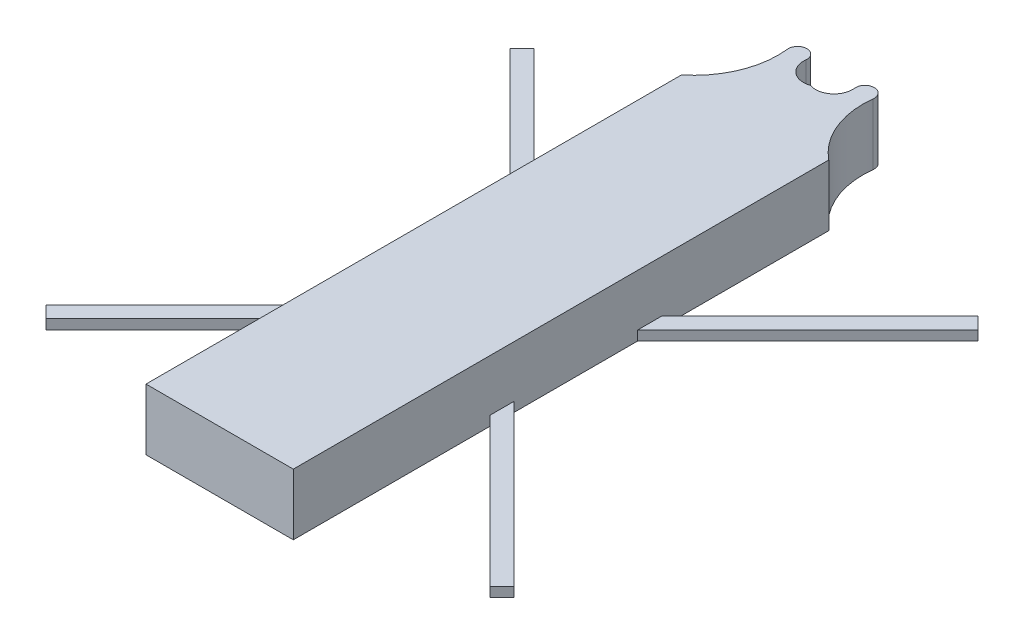
ISO-10303-21;
HEADER;
FILE_DESCRIPTION(('STEP AP214'),'2;1');
FILE_NAME('part.step','',(''),(''),'','','');
FILE_SCHEMA(('AUTOMOTIVE_DESIGN { 1 0 10303 214 1 1 1 1 }'));
ENDSEC;
DATA;
#1=APPLICATION_CONTEXT('core data for automotive mechanical design processes');
#2=APPLICATION_PROTOCOL_DEFINITION('international standard','automotive_design',2000,#1);
#3=PRODUCT_CONTEXT('',#1,'mechanical');
#4=PRODUCT('Part','Part','',(#3));
#5=PRODUCT_RELATED_PRODUCT_CATEGORY('part','',(#4));
#6=PRODUCT_DEFINITION_FORMATION('','',#4);
#7=PRODUCT_DEFINITION_CONTEXT('part definition',#1,'design');
#8=PRODUCT_DEFINITION('design','',#6,#7);
#9=PRODUCT_DEFINITION_SHAPE('','',#8);
#10=(LENGTH_UNIT() NAMED_UNIT(*) SI_UNIT(.MILLI.,.METRE.));
#11=(NAMED_UNIT(*) PLANE_ANGLE_UNIT() SI_UNIT($,.RADIAN.));
#12=(NAMED_UNIT(*) SI_UNIT($,.STERADIAN.) SOLID_ANGLE_UNIT());
#13=UNCERTAINTY_MEASURE_WITH_UNIT(LENGTH_MEASURE(1.E-05),#10,'distance_accuracy_value','');
#14=(GEOMETRIC_REPRESENTATION_CONTEXT(3) GLOBAL_UNCERTAINTY_ASSIGNED_CONTEXT((#13)) GLOBAL_UNIT_ASSIGNED_CONTEXT((#10,
#11,#12)) REPRESENTATION_CONTEXT('',''));
#15=CARTESIAN_POINT('',(0.,0.,0.));
#16=DIRECTION('',(0.,0.,1.));
#17=DIRECTION('',(1.,0.,0.));
#18=AXIS2_PLACEMENT_3D('',#15,#16,#17);
#19=CARTESIAN_POINT('',(-35.1155,0.,35.1155000000002));
#20=DIRECTION('',(-1.,0.,0.));
#21=DIRECTION('',(0.,0.,1.));
#22=AXIS2_PLACEMENT_3D('',#19,#20,#21);
#23=PLANE('',#22);
#24=DIRECTION('',(0.,-1.,0.));
#25=VECTOR('',#24,1.);
#26=CARTESIAN_POINT('',(-35.1155,29.21,-105.41));
#27=LINE('',#26,#25);
#28=CARTESIAN_POINT('',(-35.1155,29.21,-105.41));
#29=VERTEX_POINT('',#28);
#30=CARTESIAN_POINT('',(-35.1155,0.,-105.41));
#31=VERTEX_POINT('',#30);
#32=EDGE_CURVE('E168',#29,#31,#27,.T.);
#33=ORIENTED_EDGE('',*,*,#32,.T.);
#34=DIRECTION('',(0.,0.,1.));
#35=VECTOR('',#34,1.);
#36=CARTESIAN_POINT('',(-35.1155,0.,149.86));
#37=LINE('',#36,#35);
#38=CARTESIAN_POINT('',(-35.1155,0.,149.86));
#39=VERTEX_POINT('',#38);
#40=EDGE_CURVE('E13',#31,#39,#37,.T.);
#41=ORIENTED_EDGE('',*,*,#40,.T.);
#42=DIRECTION('',(0.,-1.,0.));
#43=VECTOR('',#42,1.);
#44=CARTESIAN_POINT('',(-35.1155,29.21,149.86));
#45=LINE('',#44,#43);
#46=CARTESIAN_POINT('',(-35.1155,29.21,149.86));
#47=VERTEX_POINT('',#46);
#48=EDGE_CURVE('E239',#47,#39,#45,.T.);
#49=ORIENTED_EDGE('',*,*,#48,.F.);
#50=DIRECTION('',(0.,0.,1.));
#51=VECTOR('',#50,1.);
#52=CARTESIAN_POINT('',(-35.1155,29.21,149.86));
#53=LINE('',#52,#51);
#54=EDGE_CURVE('E58',#29,#47,#53,.T.);
#55=ORIENTED_EDGE('',*,*,#54,.F.);
#56=EDGE_LOOP('',(#33,#41,#49,#55));
#57=FACE_BOUND('',#56,.T.);
#58=ADVANCED_FACE('F54',(#57),#23,.T.);
#59=CARTESIAN_POINT('',(35.1155,0.,-14.1463446288162));
#60=DIRECTION('',(1.,0.,0.));
#61=DIRECTION('',(0.,0.,-1.));
#62=AXIS2_PLACEMENT_3D('',#59,#60,#61);
#63=PLANE('',#62);
#64=DIRECTION('',(0.,-1.,0.));
#65=VECTOR('',#64,1.);
#66=CARTESIAN_POINT('',(35.1155,29.21,149.86));
#67=LINE('',#66,#65);
#68=CARTESIAN_POINT('',(35.1155,29.21,149.86));
#69=VERTEX_POINT('',#68);
#70=CARTESIAN_POINT('',(35.1155,0.,149.86));
#71=VERTEX_POINT('',#70);
#72=EDGE_CURVE('E138',#69,#71,#67,.T.);
#73=ORIENTED_EDGE('',*,*,#72,.T.);
#74=DIRECTION('',(0.,0.,-1.));
#75=VECTOR('',#74,1.);
#76=CARTESIAN_POINT('',(35.1155,0.,149.86));
#77=LINE('',#76,#75);
#78=CARTESIAN_POINT('',(35.1155,0.,-105.41));
#79=VERTEX_POINT('',#78);
#80=EDGE_CURVE('E132',#71,#79,#77,.T.);
#81=ORIENTED_EDGE('',*,*,#80,.T.);
#82=DIRECTION('',(0.,-1.,0.));
#83=VECTOR('',#82,1.);
#84=CARTESIAN_POINT('',(35.1155,29.21,-105.41));
#85=LINE('',#84,#83);
#86=CARTESIAN_POINT('',(35.1155,29.21,-105.41));
#87=VERTEX_POINT('',#86);
#88=EDGE_CURVE('E136',#87,#79,#85,.T.);
#89=ORIENTED_EDGE('',*,*,#88,.F.);
#90=DIRECTION('',(0.,0.,-1.));
#91=VECTOR('',#90,1.);
#92=CARTESIAN_POINT('',(35.1155,29.21,149.86));
#93=LINE('',#92,#91);
#94=EDGE_CURVE('E182',#69,#87,#93,.T.);
#95=ORIENTED_EDGE('',*,*,#94,.F.);
#96=EDGE_LOOP('',(#73,#81,#89,#95));
#97=FACE_BOUND('',#96,.T.);
#98=ADVANCED_FACE('F134',(#97),#63,.T.);
#99=CARTESIAN_POINT('',(-60.3181446143553,0.,-136.622759184095));
#100=DIRECTION('',(0.,-1.,0.));
#101=DIRECTION('',(0.,0.,-1.));
#102=AXIS2_PLACEMENT_3D('',#99,#100,#101);
#103=PLANE('',#102);
#104=ORIENTED_EDGE('',*,*,#40,.F.);
#105=CARTESIAN_POINT('',(-60.3181446143553,0.,-136.622759184095));
#106=DIRECTION('',(0.,-1.,0.));
#107=DIRECTION('',(0.,0.,-1.));
#108=AXIS2_PLACEMENT_3D('',#105,#106,#107);
#109=CIRCLE('',#108,40.1174479677087);
#110=CARTESIAN_POINT('',(-20.4654381266415,0.,-141.224));
#111=VERTEX_POINT('',#110);
#112=EDGE_CURVE('E186',#111,#31,#109,.T.);
#113=ORIENTED_EDGE('',*,*,#112,.F.);
#114=CARTESIAN_POINT('',(-16.0655,0.,-141.732));
#115=DIRECTION('',(0.,1.,0.));
#116=DIRECTION('',(0.,0.,-1.));
#117=AXIS2_PLACEMENT_3D('',#114,#115,#116);
#118=CIRCLE('',#117,4.42916691018457);
#119=CARTESIAN_POINT('',(-11.6655618733584,0.,-141.224));
#120=VERTEX_POINT('',#119);
#121=EDGE_CURVE('E189',#120,#111,#118,.T.);
#122=ORIENTED_EDGE('',*,*,#121,.F.);
#123=CARTESIAN_POINT('',(-2.8656856200749,0.,-140.208));
#124=DIRECTION('',(0.,-1.,0.));
#125=DIRECTION('',(0.,0.,1.));
#126=AXIS2_PLACEMENT_3D('',#123,#124,#125);
#127=CIRCLE('',#126,8.85833382036956);
#128=CARTESIAN_POINT('',(0.,0.,-131.826));
#129=VERTEX_POINT('',#128);
#130=EDGE_CURVE('E195',#129,#120,#127,.T.);
#131=ORIENTED_EDGE('',*,*,#130,.F.);
#132=CARTESIAN_POINT('',(2.86568562007493,0.,-140.208));
#133=DIRECTION('',(0.,-1.,0.));
#134=DIRECTION('',(0.,0.,-1.));
#135=AXIS2_PLACEMENT_3D('',#132,#133,#134);
#136=CIRCLE('',#135,8.85833382036956);
#137=CARTESIAN_POINT('',(11.6655618733585,0.,-141.224));
#138=VERTEX_POINT('',#137);
#139=EDGE_CURVE('E158',#138,#129,#136,.T.);
#140=ORIENTED_EDGE('',*,*,#139,.F.);
#141=CARTESIAN_POINT('',(16.0655,0.,-141.732));
#142=DIRECTION('',(0.,1.,0.));
#143=DIRECTION('',(0.,0.,1.));
#144=AXIS2_PLACEMENT_3D('',#141,#142,#143);
#145=CIRCLE('',#144,4.42916691018457);
#146=CARTESIAN_POINT('',(20.4654381266416,0.,-141.224));
#147=VERTEX_POINT('',#146);
#148=EDGE_CURVE('E154',#147,#138,#145,.T.);
#149=ORIENTED_EDGE('',*,*,#148,.F.);
#150=CARTESIAN_POINT('',(60.3181446143553,0.,-136.622759184095));
#151=DIRECTION('',(0.,-1.,0.));
#152=DIRECTION('',(0.,0.,1.));
#153=AXIS2_PLACEMENT_3D('',#150,#151,#152);
#154=CIRCLE('',#153,40.1174479677087);
#155=EDGE_CURVE('E142',#79,#147,#154,.T.);
#156=ORIENTED_EDGE('',*,*,#155,.F.);
#157=ORIENTED_EDGE('',*,*,#80,.F.);
#158=DIRECTION('',(1.,0.,0.));
#159=VECTOR('',#158,1.);
#160=CARTESIAN_POINT('',(-35.1155,0.,149.86));
#161=LINE('',#160,#159);
#162=EDGE_CURVE('E65',#39,#71,#161,.T.);
#163=ORIENTED_EDGE('',*,*,#162,.F.);
#164=EDGE_LOOP('',(#104,#113,#122,#131,#140,#149,#156,#157,#163));
#165=FACE_BOUND('',#164,.T.);
#166=ADVANCED_FACE('F56',(#165),#103,.T.);
#167=CARTESIAN_POINT('',(-35.1155,29.21,149.86));
#168=DIRECTION('',(0.,0.,-1.));
#169=DIRECTION('',(-1.,0.,0.));
#170=AXIS2_PLACEMENT_3D('',#167,#168,#169);
#171=PLANE('',#170);
#172=ORIENTED_EDGE('',*,*,#162,.T.);
#173=ORIENTED_EDGE('',*,*,#72,.F.);
#174=DIRECTION('',(1.,0.,0.));
#175=VECTOR('',#174,1.);
#176=CARTESIAN_POINT('',(-35.1155,29.21,149.86));
#177=LINE('',#176,#175);
#178=EDGE_CURVE('E104',#47,#69,#177,.T.);
#179=ORIENTED_EDGE('',*,*,#178,.F.);
#180=ORIENTED_EDGE('',*,*,#48,.T.);
#181=EDGE_LOOP('',(#172,#173,#179,#180));
#182=FACE_BOUND('',#181,.T.);
#183=ADVANCED_FACE('F241',(#182),#171,.F.);
#184=CARTESIAN_POINT('',(60.3181446143553,29.21,-136.622759184095));
#185=DIRECTION('',(0.,-1.,0.));
#186=DIRECTION('',(0.,0.,-1.));
#187=AXIS2_PLACEMENT_3D('',#184,#185,#186);
#188=CYLINDRICAL_SURFACE('',#187,40.1174479677087);
#189=ORIENTED_EDGE('',*,*,#155,.T.);
#190=DIRECTION('',(0.,-1.,0.));
#191=VECTOR('',#190,1.);
#192=CARTESIAN_POINT('',(20.4654381266416,29.21,-141.224));
#193=LINE('',#192,#191);
#194=CARTESIAN_POINT('',(20.4654381266416,29.21,-141.224));
#195=VERTEX_POINT('',#194);
#196=EDGE_CURVE('E150',#195,#147,#193,.T.);
#197=ORIENTED_EDGE('',*,*,#196,.F.);
#198=CARTESIAN_POINT('',(60.3181446143553,29.21,-136.622759184095));
#199=DIRECTION('',(0.,-1.,0.));
#200=DIRECTION('',(0.,0.,1.));
#201=AXIS2_PLACEMENT_3D('',#198,#199,#200);
#202=CIRCLE('',#201,40.1174479677087);
#203=EDGE_CURVE('E148',#87,#195,#202,.T.);
#204=ORIENTED_EDGE('',*,*,#203,.F.);
#205=ORIENTED_EDGE('',*,*,#88,.T.);
#206=EDGE_LOOP('',(#189,#197,#204,#205));
#207=FACE_BOUND('',#206,.T.);
#208=ADVANCED_FACE('F145',(#207),#188,.F.);
#209=CARTESIAN_POINT('',(16.0655,29.21,-141.732));
#210=DIRECTION('',(0.,-1.,0.));
#211=DIRECTION('',(0.,0.,-1.));
#212=AXIS2_PLACEMENT_3D('',#209,#210,#211);
#213=CYLINDRICAL_SURFACE('',#212,4.42916691018457);
#214=ORIENTED_EDGE('',*,*,#148,.T.);
#215=DIRECTION('',(0.,-1.,0.));
#216=VECTOR('',#215,1.);
#217=CARTESIAN_POINT('',(11.6655618733585,29.21,-141.224));
#218=LINE('',#217,#216);
#219=CARTESIAN_POINT('',(11.6655618733585,29.21,-141.224));
#220=VERTEX_POINT('',#219);
#221=EDGE_CURVE('E211',#220,#138,#218,.T.);
#222=ORIENTED_EDGE('',*,*,#221,.F.);
#223=CARTESIAN_POINT('',(16.0655,29.21,-141.732));
#224=DIRECTION('',(0.,1.,0.));
#225=DIRECTION('',(0.,0.,1.));
#226=AXIS2_PLACEMENT_3D('',#223,#224,#225);
#227=CIRCLE('',#226,4.42916691018457);
#228=EDGE_CURVE('E177',#195,#220,#227,.T.);
#229=ORIENTED_EDGE('',*,*,#228,.F.);
#230=ORIENTED_EDGE('',*,*,#196,.T.);
#231=EDGE_LOOP('',(#214,#222,#229,#230));
#232=FACE_BOUND('',#231,.T.);
#233=ADVANCED_FACE('F258',(#232),#213,.T.);
#234=CARTESIAN_POINT('',(2.86568562007493,29.21,-140.208));
#235=DIRECTION('',(0.,-1.,0.));
#236=DIRECTION('',(0.,0.,-1.));
#237=AXIS2_PLACEMENT_3D('',#234,#235,#236);
#238=CYLINDRICAL_SURFACE('',#237,8.85833382036956);
#239=ORIENTED_EDGE('',*,*,#139,.T.);
#240=DIRECTION('',(0.,-1.,0.));
#241=VECTOR('',#240,1.);
#242=CARTESIAN_POINT('',(0.,29.21,-131.826));
#243=LINE('',#242,#241);
#244=CARTESIAN_POINT('',(0.,29.21,-131.826));
#245=VERTEX_POINT('',#244);
#246=EDGE_CURVE('E208',#245,#129,#243,.T.);
#247=ORIENTED_EDGE('',*,*,#246,.F.);
#248=CARTESIAN_POINT('',(2.86568562007493,29.21,-140.208));
#249=DIRECTION('',(0.,-1.,0.));
#250=DIRECTION('',(0.,0.,-1.));
#251=AXIS2_PLACEMENT_3D('',#248,#249,#250);
#252=CIRCLE('',#251,8.85833382036956);
#253=EDGE_CURVE('E174',#220,#245,#252,.T.);
#254=ORIENTED_EDGE('',*,*,#253,.F.);
#255=ORIENTED_EDGE('',*,*,#221,.T.);
#256=EDGE_LOOP('',(#239,#247,#254,#255));
#257=FACE_BOUND('',#256,.T.);
#258=ADVANCED_FACE('F206',(#257),#238,.F.);
#259=CARTESIAN_POINT('',(-2.8656856200749,29.21,-140.208));
#260=DIRECTION('',(0.,-1.,0.));
#261=DIRECTION('',(0.,0.,-1.));
#262=AXIS2_PLACEMENT_3D('',#259,#260,#261);
#263=CYLINDRICAL_SURFACE('',#262,8.85833382036956);
#264=ORIENTED_EDGE('',*,*,#130,.T.);
#265=DIRECTION('',(0.,-1.,0.));
#266=VECTOR('',#265,1.);
#267=CARTESIAN_POINT('',(-11.6655618733584,29.21,-141.224));
#268=LINE('',#267,#266);
#269=CARTESIAN_POINT('',(-11.6655618733584,29.21,-141.224));
#270=VERTEX_POINT('',#269);
#271=EDGE_CURVE('E218',#270,#120,#268,.T.);
#272=ORIENTED_EDGE('',*,*,#271,.F.);
#273=CARTESIAN_POINT('',(-2.8656856200749,29.21,-140.208));
#274=DIRECTION('',(0.,-1.,0.));
#275=DIRECTION('',(0.,0.,1.));
#276=AXIS2_PLACEMENT_3D('',#273,#274,#275);
#277=CIRCLE('',#276,8.85833382036956);
#278=EDGE_CURVE('E171',#245,#270,#277,.T.);
#279=ORIENTED_EDGE('',*,*,#278,.F.);
#280=ORIENTED_EDGE('',*,*,#246,.T.);
#281=EDGE_LOOP('',(#264,#272,#279,#280));
#282=FACE_BOUND('',#281,.T.);
#283=ADVANCED_FACE('F214',(#282),#263,.F.);
#284=CARTESIAN_POINT('',(-16.0655,29.21,-141.732));
#285=DIRECTION('',(0.,-1.,0.));
#286=DIRECTION('',(0.,0.,-1.));
#287=AXIS2_PLACEMENT_3D('',#284,#285,#286);
#288=CYLINDRICAL_SURFACE('',#287,4.42916691018457);
#289=ORIENTED_EDGE('',*,*,#121,.T.);
#290=DIRECTION('',(0.,-1.,0.));
#291=VECTOR('',#290,1.);
#292=CARTESIAN_POINT('',(-20.4654381266415,29.21,-141.224));
#293=LINE('',#292,#291);
#294=CARTESIAN_POINT('',(-20.4654381266415,29.21,-141.224));
#295=VERTEX_POINT('',#294);
#296=EDGE_CURVE('E225',#295,#111,#293,.T.);
#297=ORIENTED_EDGE('',*,*,#296,.F.);
#298=CARTESIAN_POINT('',(-16.0655,29.21,-141.732));
#299=DIRECTION('',(0.,1.,0.));
#300=DIRECTION('',(0.,0.,-1.));
#301=AXIS2_PLACEMENT_3D('',#298,#299,#300);
#302=CIRCLE('',#301,4.42916691018457);
#303=EDGE_CURVE('E167',#270,#295,#302,.T.);
#304=ORIENTED_EDGE('',*,*,#303,.F.);
#305=ORIENTED_EDGE('',*,*,#271,.T.);
#306=EDGE_LOOP('',(#289,#297,#304,#305));
#307=FACE_BOUND('',#306,.T.);
#308=ADVANCED_FACE('F223',(#307),#288,.T.);
#309=CARTESIAN_POINT('',(-60.3181446143553,29.21,-136.622759184095));
#310=DIRECTION('',(0.,-1.,0.));
#311=DIRECTION('',(0.,0.,-1.));
#312=AXIS2_PLACEMENT_3D('',#309,#310,#311);
#313=CYLINDRICAL_SURFACE('',#312,40.1174479677087);
#314=ORIENTED_EDGE('',*,*,#112,.T.);
#315=ORIENTED_EDGE('',*,*,#32,.F.);
#316=CARTESIAN_POINT('',(-60.3181446143553,29.21,-136.622759184095));
#317=DIRECTION('',(0.,-1.,0.));
#318=DIRECTION('',(0.,0.,-1.));
#319=AXIS2_PLACEMENT_3D('',#316,#317,#318);
#320=CIRCLE('',#319,40.1174479677087);
#321=EDGE_CURVE('E164',#295,#29,#320,.T.);
#322=ORIENTED_EDGE('',*,*,#321,.F.);
#323=ORIENTED_EDGE('',*,*,#296,.T.);
#324=EDGE_LOOP('',(#314,#315,#322,#323));
#325=FACE_BOUND('',#324,.T.);
#326=ADVANCED_FACE('F227',(#325),#313,.F.);
#327=CARTESIAN_POINT('',(-60.3181446143553,29.21,-136.622759184095));
#328=DIRECTION('',(0.,-1.,0.));
#329=DIRECTION('',(0.,0.,-1.));
#330=AXIS2_PLACEMENT_3D('',#327,#328,#329);
#331=PLANE('',#330);
#332=ORIENTED_EDGE('',*,*,#54,.T.);
#333=ORIENTED_EDGE('',*,*,#178,.T.);
#334=ORIENTED_EDGE('',*,*,#94,.T.);
#335=ORIENTED_EDGE('',*,*,#203,.T.);
#336=ORIENTED_EDGE('',*,*,#228,.T.);
#337=ORIENTED_EDGE('',*,*,#253,.T.);
#338=ORIENTED_EDGE('',*,*,#278,.T.);
#339=ORIENTED_EDGE('',*,*,#303,.T.);
#340=ORIENTED_EDGE('',*,*,#321,.T.);
#341=EDGE_LOOP('',(#332,#333,#334,#335,#336,#337,#338,#339,#340));
#342=FACE_BOUND('',#341,.T.);
#343=ADVANCED_FACE('F243',(#342),#331,.F.);
#344=CLOSED_SHELL('',(#58,#98,#166,#183,#208,#233,#258,#283,#308,#326,#343));
#345=MANIFOLD_SOLID_BREP('B2',#344);
#346=CARTESIAN_POINT('',(-35.1155,0.,35.1155000000002));
#347=DIRECTION('',(-1.,0.,0.));
#348=DIRECTION('',(0.,0.,1.));
#349=AXIS2_PLACEMENT_3D('',#346,#347,#348);
#350=PLANE('',#349);
#351=DIRECTION('',(0.,1.,0.));
#352=VECTOR('',#351,1.);
#353=CARTESIAN_POINT('',(-35.1155,29.2099999999996,35.1155));
#354=LINE('',#353,#352);
#355=CARTESIAN_POINT('',(-35.1155,0.,35.1155000000002));
#356=VERTEX_POINT('',#355);
#357=CARTESIAN_POINT('',(-35.1155,4.572,35.1155000000001));
#358=VERTEX_POINT('',#357);
#359=EDGE_CURVE('E421',#356,#358,#354,.T.);
#360=ORIENTED_EDGE('',*,*,#359,.T.);
#361=DIRECTION('',(0.,0.,1.));
#362=VECTOR('',#361,1.);
#363=CARTESIAN_POINT('',(-35.1155,4.572,149.86));
#364=LINE('',#363,#362);
#365=CARTESIAN_POINT('',(-35.1155,4.572,46.6461488594529));
#366=VERTEX_POINT('',#365);
#367=EDGE_CURVE('E416',#358,#366,#364,.T.);
#368=ORIENTED_EDGE('',*,*,#367,.T.);
#369=DIRECTION('',(0.,-1.,0.));
#370=VECTOR('',#369,1.);
#371=CARTESIAN_POINT('',(-35.1155,29.2100000000002,46.6461488594529));
#372=LINE('',#371,#370);
#373=CARTESIAN_POINT('',(-35.1155,0.,46.6461488594529));
#374=VERTEX_POINT('',#373);
#375=EDGE_CURVE('E373',#366,#374,#372,.T.);
#376=ORIENTED_EDGE('',*,*,#375,.T.);
#377=DIRECTION('',(0.,0.,-1.));
#378=VECTOR('',#377,1.);
#379=CARTESIAN_POINT('',(-35.1155,0.,-136.622759184095));
#380=LINE('',#379,#378);
#381=EDGE_CURVE('E411',#374,#356,#380,.T.);
#382=ORIENTED_EDGE('',*,*,#381,.T.);
#383=EDGE_LOOP('',(#360,#368,#376,#382));
#384=FACE_BOUND('',#383,.T.);
#385=ADVANCED_FACE('F369',(#384),#350,.F.);
#386=CARTESIAN_POINT('',(-60.3181446143553,0.,-136.622759184095));
#387=DIRECTION('',(0.,-1.,0.));
#388=DIRECTION('',(0.,0.,-1.));
#389=AXIS2_PLACEMENT_3D('',#386,#387,#388);
#390=PLANE('',#389);
#391=ORIENTED_EDGE('',*,*,#381,.F.);
#392=DIRECTION('',(-0.707106781186546,0.,0.707106781186549));
#393=VECTOR('',#392,1.);
#394=CARTESIAN_POINT('',(-16.89356433676,0.,28.4242131962128));
#395=LINE('',#394,#393);
#396=CARTESIAN_POINT('',(-110.557635679511,0.,122.088284538964));
#397=VERTEX_POINT('',#396);
#398=EDGE_CURVE('E393',#374,#397,#395,.T.);
#399=ORIENTED_EDGE('',*,*,#398,.T.);
#400=DIRECTION('',(0.707106781186549,0.,0.707106781186546));
#401=VECTOR('',#400,1.);
#402=CARTESIAN_POINT('',(-116.322960109237,0.,116.322960109238));
#403=LINE('',#402,#401);
#404=CARTESIAN_POINT('',(-116.322960109237,0.,116.322960109238));
#405=VERTEX_POINT('',#404);
#406=EDGE_CURVE('E378',#405,#397,#403,.T.);
#407=ORIENTED_EDGE('',*,*,#406,.F.);
#408=DIRECTION('',(-0.707106781186546,0.,0.707106781186549));
#409=VECTOR('',#408,1.);
#410=CARTESIAN_POINT('',(-22.6588887664864,0.,22.6588887664865));
#411=LINE('',#410,#409);
#412=EDGE_CURVE('E386',#356,#405,#411,.T.);
#413=ORIENTED_EDGE('',*,*,#412,.F.);
#414=EDGE_LOOP('',(#391,#399,#407,#413));
#415=FACE_BOUND('',#414,.T.);
#416=ADVANCED_FACE('F371',(#415),#390,.T.);
#417=CARTESIAN_POINT('',(-116.322960109237,0.,116.322960109238));
#418=DIRECTION('',(0.707106781186546,0.,-0.707106781186549));
#419=DIRECTION('',(-0.707106781186549,0.,-0.707106781186546));
#420=AXIS2_PLACEMENT_3D('',#417,#418,#419);
#421=PLANE('',#420);
#422=DIRECTION('',(0.,-1.,0.));
#423=VECTOR('',#422,1.);
#424=CARTESIAN_POINT('',(-116.322960109237,0.,116.322960109238));
#425=LINE('',#424,#423);
#426=CARTESIAN_POINT('',(-116.322960109237,4.572,116.322960109238));
#427=VERTEX_POINT('',#426);
#428=EDGE_CURVE('E52',#427,#405,#425,.T.);
#429=ORIENTED_EDGE('',*,*,#428,.T.);
#430=ORIENTED_EDGE('',*,*,#406,.T.);
#431=DIRECTION('',(0.,1.,0.));
#432=VECTOR('',#431,1.);
#433=CARTESIAN_POINT('',(-110.557635679511,0.,122.088284538964));
#434=LINE('',#433,#432);
#435=CARTESIAN_POINT('',(-110.557635679511,4.572,122.088284538964));
#436=VERTEX_POINT('',#435);
#437=EDGE_CURVE('E425',#397,#436,#434,.T.);
#438=ORIENTED_EDGE('',*,*,#437,.T.);
#439=DIRECTION('',(-0.707106781186549,0.,-0.707106781186546));
#440=VECTOR('',#439,1.);
#441=CARTESIAN_POINT('',(-116.322960109237,4.572,116.322960109238));
#442=LINE('',#441,#440);
#443=EDGE_CURVE('E428',#436,#427,#442,.T.);
#444=ORIENTED_EDGE('',*,*,#443,.T.);
#445=EDGE_LOOP('',(#429,#430,#438,#444));
#446=FACE_BOUND('',#445,.T.);
#447=ADVANCED_FACE('F443',(#446),#421,.F.);
#448=CARTESIAN_POINT('',(-22.6588887664864,4.572,22.6588887664864));
#449=DIRECTION('',(0.,1.,0.));
#450=DIRECTION('',(0.,0.,1.));
#451=AXIS2_PLACEMENT_3D('',#448,#449,#450);
#452=PLANE('',#451);
#453=ORIENTED_EDGE('',*,*,#367,.F.);
#454=DIRECTION('',(-0.707106781186546,0.,0.707106781186549));
#455=VECTOR('',#454,1.);
#456=CARTESIAN_POINT('',(-22.6588887664864,4.572,22.6588887664864));
#457=LINE('',#456,#455);
#458=EDGE_CURVE('E415',#358,#427,#457,.T.);
#459=ORIENTED_EDGE('',*,*,#458,.T.);
#460=ORIENTED_EDGE('',*,*,#443,.F.);
#461=DIRECTION('',(-0.707106781186546,0.,0.707106781186549));
#462=VECTOR('',#461,1.);
#463=CARTESIAN_POINT('',(-16.89356433676,4.572,28.4242131962128));
#464=LINE('',#463,#462);
#465=EDGE_CURVE('E426',#366,#436,#464,.T.);
#466=ORIENTED_EDGE('',*,*,#465,.F.);
#467=EDGE_LOOP('',(#453,#459,#460,#466));
#468=FACE_BOUND('',#467,.T.);
#469=ADVANCED_FACE('F441',(#468),#452,.T.);
#470=CARTESIAN_POINT('',(-16.89356433676,0.,28.4242131962128));
#471=DIRECTION('',(0.707106781186549,0.,0.707106781186546));
#472=DIRECTION('',(0.707106781186546,0.,-0.707106781186549));
#473=AXIS2_PLACEMENT_3D('',#470,#471,#472);
#474=PLANE('',#473);
#475=ORIENTED_EDGE('',*,*,#375,.F.);
#476=ORIENTED_EDGE('',*,*,#465,.T.);
#477=ORIENTED_EDGE('',*,*,#437,.F.);
#478=ORIENTED_EDGE('',*,*,#398,.F.);
#479=EDGE_LOOP('',(#475,#476,#477,#478));
#480=FACE_BOUND('',#479,.T.);
#481=ADVANCED_FACE('F423',(#480),#474,.T.);
#482=CARTESIAN_POINT('',(-22.6588887664864,0.,22.6588887664865));
#483=DIRECTION('',(-0.707106781186549,0.,-0.707106781186546));
#484=DIRECTION('',(-0.707106781186546,0.,0.707106781186549));
#485=AXIS2_PLACEMENT_3D('',#482,#483,#484);
#486=PLANE('',#485);
#487=ORIENTED_EDGE('',*,*,#359,.F.);
#488=ORIENTED_EDGE('',*,*,#412,.T.);
#489=ORIENTED_EDGE('',*,*,#428,.F.);
#490=ORIENTED_EDGE('',*,*,#458,.F.);
#491=EDGE_LOOP('',(#487,#488,#489,#490));
#492=FACE_BOUND('',#491,.T.);
#493=ADVANCED_FACE('F438',(#492),#486,.T.);
#494=CLOSED_SHELL('',(#385,#416,#447,#469,#481,#493));
#495=MANIFOLD_SOLID_BREP('B7',#494);
#496=CARTESIAN_POINT('',(-35.1155,0.,35.1155000000002));
#497=DIRECTION('',(-1.,0.,0.));
#498=DIRECTION('',(0.,0.,1.));
#499=AXIS2_PLACEMENT_3D('',#496,#497,#498);
#500=PLANE('',#499);
#501=DIRECTION('',(0.,0.,-1.));
#502=VECTOR('',#501,1.);
#503=CARTESIAN_POINT('',(-35.1155,0.,-136.622759184095));
#504=LINE('',#503,#502);
#505=CARTESIAN_POINT('',(-35.1155,0.,-23.5848511405473));
#506=VERTEX_POINT('',#505);
#507=CARTESIAN_POINT('',(-35.1155,0.,-35.1155000000001));
#508=VERTEX_POINT('',#507);
#509=EDGE_CURVE('E561',#506,#508,#504,.T.);
#510=ORIENTED_EDGE('',*,*,#509,.T.);
#511=DIRECTION('',(0.,1.,0.));
#512=VECTOR('',#511,1.);
#513=CARTESIAN_POINT('',(-35.1155,29.2099999999994,-35.1155000000002));
#514=LINE('',#513,#512);
#515=CARTESIAN_POINT('',(-35.1155,4.572,-35.1155000000001));
#516=VERTEX_POINT('',#515);
#517=EDGE_CURVE('E565',#508,#516,#514,.T.);
#518=ORIENTED_EDGE('',*,*,#517,.T.);
#519=DIRECTION('',(0.,0.,1.));
#520=VECTOR('',#519,1.);
#521=CARTESIAN_POINT('',(-35.1155,4.572,149.86));
#522=LINE('',#521,#520);
#523=CARTESIAN_POINT('',(-35.1155,4.572,-23.5848511405473));
#524=VERTEX_POINT('',#523);
#525=EDGE_CURVE('E562',#516,#524,#522,.T.);
#526=ORIENTED_EDGE('',*,*,#525,.T.);
#527=DIRECTION('',(0.,-1.,0.));
#528=VECTOR('',#527,1.);
#529=CARTESIAN_POINT('',(-35.1155,29.2100000000003,-23.5848511405473));
#530=LINE('',#529,#528);
#531=EDGE_CURVE('E519',#524,#506,#530,.T.);
#532=ORIENTED_EDGE('',*,*,#531,.T.);
#533=EDGE_LOOP('',(#510,#518,#526,#532));
#534=FACE_BOUND('',#533,.T.);
#535=ADVANCED_FACE('F515',(#534),#500,.F.);
#536=CARTESIAN_POINT('',(-60.3181446143553,0.,-136.622759184095));
#537=DIRECTION('',(0.,-1.,0.));
#538=DIRECTION('',(0.,0.,-1.));
#539=AXIS2_PLACEMENT_3D('',#536,#537,#538);
#540=PLANE('',#539);
#541=ORIENTED_EDGE('',*,*,#509,.F.);
#542=DIRECTION('',(-0.707106781186546,0.,-0.707106781186549));
#543=VECTOR('',#542,1.);
#544=CARTESIAN_POINT('',(-17.9396355106206,0.,-6.4089866511679));
#545=LINE('',#544,#543);
#546=CARTESIAN_POINT('',(-111.603706853372,0.,-100.073057993919));
#547=VERTEX_POINT('',#546);
#548=EDGE_CURVE('E539',#506,#547,#545,.T.);
#549=ORIENTED_EDGE('',*,*,#548,.T.);
#550=DIRECTION('',(-0.707106781186548,0.,0.707106781186547));
#551=VECTOR('',#550,1.);
#552=CARTESIAN_POINT('',(-105.838382423645,0.,-105.838382423646));
#553=LINE('',#552,#551);
#554=CARTESIAN_POINT('',(-105.838382423645,0.,-105.838382423646));
#555=VERTEX_POINT('',#554);
#556=EDGE_CURVE('E524',#555,#547,#553,.T.);
#557=ORIENTED_EDGE('',*,*,#556,.F.);
#558=DIRECTION('',(-0.707106781186546,0.,-0.707106781186549));
#559=VECTOR('',#558,1.);
#560=CARTESIAN_POINT('',(-12.1743110808942,0.,-12.1743110808943));
#561=LINE('',#560,#559);
#562=EDGE_CURVE('E532',#508,#555,#561,.T.);
#563=ORIENTED_EDGE('',*,*,#562,.F.);
#564=EDGE_LOOP('',(#541,#549,#557,#563));
#565=FACE_BOUND('',#564,.T.);
#566=ADVANCED_FACE('F517',(#565),#540,.T.);
#567=CARTESIAN_POINT('',(-105.838382423645,0.,-105.838382423646));
#568=DIRECTION('',(0.707106781186546,0.,0.707106781186549));
#569=DIRECTION('',(0.707106781186549,0.,-0.707106781186546));
#570=AXIS2_PLACEMENT_3D('',#567,#568,#569);
#571=PLANE('',#570);
#572=DIRECTION('',(0.,-1.,0.));
#573=VECTOR('',#572,1.);
#574=CARTESIAN_POINT('',(-105.838382423645,0.,-105.838382423646));
#575=LINE('',#574,#573);
#576=CARTESIAN_POINT('',(-105.838382423645,4.572,-105.838382423646));
#577=VERTEX_POINT('',#576);
#578=EDGE_CURVE('E367',#577,#555,#575,.T.);
#579=ORIENTED_EDGE('',*,*,#578,.T.);
#580=ORIENTED_EDGE('',*,*,#556,.T.);
#581=DIRECTION('',(0.,1.,0.));
#582=VECTOR('',#581,1.);
#583=CARTESIAN_POINT('',(-111.603706853372,0.,-100.073057993919));
#584=LINE('',#583,#582);
#585=CARTESIAN_POINT('',(-111.603706853372,4.572,-100.073057993919));
#586=VERTEX_POINT('',#585);
#587=EDGE_CURVE('E571',#547,#586,#584,.T.);
#588=ORIENTED_EDGE('',*,*,#587,.T.);
#589=DIRECTION('',(0.707106781186549,0.,-0.707106781186546));
#590=VECTOR('',#589,1.);
#591=CARTESIAN_POINT('',(-105.838382423645,4.572,-105.838382423646));
#592=LINE('',#591,#590);
#593=EDGE_CURVE('E574',#586,#577,#592,.T.);
#594=ORIENTED_EDGE('',*,*,#593,.T.);
#595=EDGE_LOOP('',(#579,#580,#588,#594));
#596=FACE_BOUND('',#595,.T.);
#597=ADVANCED_FACE('F589',(#596),#571,.F.);
#598=CARTESIAN_POINT('',(-12.1743110808942,4.572,-12.1743110808943));
#599=DIRECTION('',(0.,1.,0.));
#600=DIRECTION('',(0.,0.,1.));
#601=AXIS2_PLACEMENT_3D('',#598,#599,#600);
#602=PLANE('',#601);
#603=ORIENTED_EDGE('',*,*,#525,.F.);
#604=DIRECTION('',(-0.707106781186546,0.,-0.707106781186549));
#605=VECTOR('',#604,1.);
#606=CARTESIAN_POINT('',(-12.1743110808942,4.572,-12.1743110808943));
#607=LINE('',#606,#605);
#608=EDGE_CURVE('E566',#516,#577,#607,.T.);
#609=ORIENTED_EDGE('',*,*,#608,.T.);
#610=ORIENTED_EDGE('',*,*,#593,.F.);
#611=DIRECTION('',(-0.707106781186546,0.,-0.707106781186549));
#612=VECTOR('',#611,1.);
#613=CARTESIAN_POINT('',(-17.9396355106206,4.572,-6.4089866511679));
#614=LINE('',#613,#612);
#615=EDGE_CURVE('E572',#524,#586,#614,.T.);
#616=ORIENTED_EDGE('',*,*,#615,.F.);
#617=EDGE_LOOP('',(#603,#609,#610,#616));
#618=FACE_BOUND('',#617,.T.);
#619=ADVANCED_FACE('F587',(#618),#602,.T.);
#620=CARTESIAN_POINT('',(-17.9396355106206,0.,-6.4089866511679));
#621=DIRECTION('',(-0.707106781186549,0.,0.707106781186546));
#622=DIRECTION('',(0.707106781186546,0.,0.707106781186549));
#623=AXIS2_PLACEMENT_3D('',#620,#621,#622);
#624=PLANE('',#623);
#625=ORIENTED_EDGE('',*,*,#531,.F.);
#626=ORIENTED_EDGE('',*,*,#615,.T.);
#627=ORIENTED_EDGE('',*,*,#587,.F.);
#628=ORIENTED_EDGE('',*,*,#548,.F.);
#629=EDGE_LOOP('',(#625,#626,#627,#628));
#630=FACE_BOUND('',#629,.T.);
#631=ADVANCED_FACE('F569',(#630),#624,.T.);
#632=CARTESIAN_POINT('',(-12.1743110808942,0.,-12.1743110808943));
#633=DIRECTION('',(0.707106781186549,0.,-0.707106781186546));
#634=DIRECTION('',(-0.707106781186546,0.,-0.707106781186549));
#635=AXIS2_PLACEMENT_3D('',#632,#633,#634);
#636=PLANE('',#635);
#637=ORIENTED_EDGE('',*,*,#517,.F.);
#638=ORIENTED_EDGE('',*,*,#562,.T.);
#639=ORIENTED_EDGE('',*,*,#578,.F.);
#640=ORIENTED_EDGE('',*,*,#608,.F.);
#641=EDGE_LOOP('',(#637,#638,#639,#640));
#642=FACE_BOUND('',#641,.T.);
#643=ADVANCED_FACE('F584',(#642),#636,.T.);
#644=CLOSED_SHELL('',(#535,#566,#597,#619,#631,#643));
#645=MANIFOLD_SOLID_BREP('B46',#644);
#646=CARTESIAN_POINT('',(35.1155,0.,-14.1463446288162));
#647=DIRECTION('',(1.,0.,0.));
#648=DIRECTION('',(0.,0.,-1.));
#649=AXIS2_PLACEMENT_3D('',#646,#647,#648);
#650=PLANE('',#649);
#651=DIRECTION('',(0.,1.,0.));
#652=VECTOR('',#651,1.);
#653=CARTESIAN_POINT('',(35.1155,29.2100000000005,-14.1463446288162));
#654=LINE('',#653,#652);
#655=CARTESIAN_POINT('',(35.1155,0.,-14.1463446288162));
#656=VERTEX_POINT('',#655);
#657=CARTESIAN_POINT('',(35.1155,4.572,-14.1463446288163));
#658=VERTEX_POINT('',#657);
#659=EDGE_CURVE('E712',#656,#658,#654,.T.);
#660=ORIENTED_EDGE('',*,*,#659,.T.);
#661=DIRECTION('',(0.,0.,-1.));
#662=VECTOR('',#661,1.);
#663=CARTESIAN_POINT('',(35.1155,4.572,149.86));
#664=LINE('',#663,#662);
#665=CARTESIAN_POINT('',(35.1155,4.572,-25.6769934882692));
#666=VERTEX_POINT('',#665);
#667=EDGE_CURVE('E707',#658,#666,#664,.T.);
#668=ORIENTED_EDGE('',*,*,#667,.T.);
#669=DIRECTION('',(0.,-1.,0.));
#670=VECTOR('',#669,1.);
#671=CARTESIAN_POINT('',(35.1155,29.2099999999997,-25.6769934882692));
#672=LINE('',#671,#670);
#673=CARTESIAN_POINT('',(35.1155,0.,-25.6769934882691));
#674=VERTEX_POINT('',#673);
#675=EDGE_CURVE('E664',#666,#674,#672,.T.);
#676=ORIENTED_EDGE('',*,*,#675,.T.);
#677=DIRECTION('',(0.,0.,1.));
#678=VECTOR('',#677,1.);
#679=CARTESIAN_POINT('',(35.1155,0.,-136.622759184095));
#680=LINE('',#679,#678);
#681=EDGE_CURVE('E702',#674,#656,#680,.T.);
#682=ORIENTED_EDGE('',*,*,#681,.T.);
#683=EDGE_LOOP('',(#660,#668,#676,#682));
#684=FACE_BOUND('',#683,.T.);
#685=ADVANCED_FACE('F660',(#684),#650,.F.);
#686=CARTESIAN_POINT('',(-60.3181446143553,0.,-136.622759184095));
#687=DIRECTION('',(0.,-1.,0.));
#688=DIRECTION('',(0.,0.,-1.));
#689=AXIS2_PLACEMENT_3D('',#686,#687,#688);
#690=PLANE('',#689);
#691=ORIENTED_EDGE('',*,*,#681,.F.);
#692=DIRECTION('',(0.707106781186541,0.,-0.707106781186554));
#693=VECTOR('',#692,1.);
#694=CARTESIAN_POINT('',(16.8935643367598,0.,-7.45505782502868));
#695=LINE('',#694,#693);
#696=CARTESIAN_POINT('',(110.55763567951,0.,-101.119129167781));
#697=VERTEX_POINT('',#696);
#698=EDGE_CURVE('E684',#674,#697,#695,.T.);
#699=ORIENTED_EDGE('',*,*,#698,.T.);
#700=DIRECTION('',(-0.707106781186554,0.,-0.707106781186541));
#701=VECTOR('',#700,1.);
#702=CARTESIAN_POINT('',(116.322960109237,0.,-95.3538047380544));
#703=LINE('',#702,#701);
#704=CARTESIAN_POINT('',(116.322960109237,0.,-95.3538047380544));
#705=VERTEX_POINT('',#704);
#706=EDGE_CURVE('E669',#705,#697,#703,.T.);
#707=ORIENTED_EDGE('',*,*,#706,.F.);
#708=DIRECTION('',(0.707106781186541,0.,-0.707106781186554));
#709=VECTOR('',#708,1.);
#710=CARTESIAN_POINT('',(22.6588887664863,0.,-1.68973339530234));
#711=LINE('',#710,#709);
#712=EDGE_CURVE('E677',#656,#705,#711,.T.);
#713=ORIENTED_EDGE('',*,*,#712,.F.);
#714=EDGE_LOOP('',(#691,#699,#707,#713));
#715=FACE_BOUND('',#714,.T.);
#716=ADVANCED_FACE('F662',(#715),#690,.T.);
#717=CARTESIAN_POINT('',(116.322960109237,0.,-95.3538047380544));
#718=DIRECTION('',(-0.707106781186541,0.,0.707106781186554));
#719=DIRECTION('',(0.707106781186554,0.,0.707106781186541));
#720=AXIS2_PLACEMENT_3D('',#717,#718,#719);
#721=PLANE('',#720);
#722=DIRECTION('',(0.,-1.,0.));
#723=VECTOR('',#722,1.);
#724=CARTESIAN_POINT('',(116.322960109237,0.,-95.3538047380544));
#725=LINE('',#724,#723);
#726=CARTESIAN_POINT('',(116.322960109237,4.572,-95.3538047380544));
#727=VERTEX_POINT('',#726);
#728=EDGE_CURVE('E513',#727,#705,#725,.T.);
#729=ORIENTED_EDGE('',*,*,#728,.T.);
#730=ORIENTED_EDGE('',*,*,#706,.T.);
#731=DIRECTION('',(0.,1.,0.));
#732=VECTOR('',#731,1.);
#733=CARTESIAN_POINT('',(110.55763567951,0.,-101.119129167781));
#734=LINE('',#733,#732);
#735=CARTESIAN_POINT('',(110.55763567951,4.572,-101.119129167781));
#736=VERTEX_POINT('',#735);
#737=EDGE_CURVE('E716',#697,#736,#734,.T.);
#738=ORIENTED_EDGE('',*,*,#737,.T.);
#739=DIRECTION('',(0.707106781186554,0.,0.707106781186541));
#740=VECTOR('',#739,1.);
#741=CARTESIAN_POINT('',(116.322960109237,4.572,-95.3538047380544));
#742=LINE('',#741,#740);
#743=EDGE_CURVE('E719',#736,#727,#742,.T.);
#744=ORIENTED_EDGE('',*,*,#743,.T.);
#745=EDGE_LOOP('',(#729,#730,#738,#744));
#746=FACE_BOUND('',#745,.T.);
#747=ADVANCED_FACE('F734',(#746),#721,.F.);
#748=CARTESIAN_POINT('',(22.6588887664863,4.572,-1.68973339530233));
#749=DIRECTION('',(0.,1.,0.));
#750=DIRECTION('',(0.,0.,1.));
#751=AXIS2_PLACEMENT_3D('',#748,#749,#750);
#752=PLANE('',#751);
#753=ORIENTED_EDGE('',*,*,#667,.F.);
#754=DIRECTION('',(0.707106781186541,0.,-0.707106781186554));
#755=VECTOR('',#754,1.);
#756=CARTESIAN_POINT('',(22.6588887664863,4.572,-1.68973339530233));
#757=LINE('',#756,#755);
#758=EDGE_CURVE('E706',#658,#727,#757,.T.);
#759=ORIENTED_EDGE('',*,*,#758,.T.);
#760=ORIENTED_EDGE('',*,*,#743,.F.);
#761=DIRECTION('',(0.707106781186541,0.,-0.707106781186554));
#762=VECTOR('',#761,1.);
#763=CARTESIAN_POINT('',(16.8935643367598,4.572,-7.45505782502869));
#764=LINE('',#763,#762);
#765=EDGE_CURVE('E717',#666,#736,#764,.T.);
#766=ORIENTED_EDGE('',*,*,#765,.F.);
#767=EDGE_LOOP('',(#753,#759,#760,#766));
#768=FACE_BOUND('',#767,.T.);
#769=ADVANCED_FACE('F732',(#768),#752,.T.);
#770=CARTESIAN_POINT('',(16.8935643367598,0.,-7.45505782502868));
#771=DIRECTION('',(-0.707106781186554,0.,-0.707106781186541));
#772=DIRECTION('',(-0.707106781186541,0.,0.707106781186554));
#773=AXIS2_PLACEMENT_3D('',#770,#771,#772);
#774=PLANE('',#773);
#775=ORIENTED_EDGE('',*,*,#675,.F.);
#776=ORIENTED_EDGE('',*,*,#765,.T.);
#777=ORIENTED_EDGE('',*,*,#737,.F.);
#778=ORIENTED_EDGE('',*,*,#698,.F.);
#779=EDGE_LOOP('',(#775,#776,#777,#778));
#780=FACE_BOUND('',#779,.T.);
#781=ADVANCED_FACE('F714',(#780),#774,.T.);
#782=CARTESIAN_POINT('',(22.6588887664863,0.,-1.68973339530234));
#783=DIRECTION('',(0.707106781186554,0.,0.707106781186541));
#784=DIRECTION('',(0.707106781186541,0.,-0.707106781186554));
#785=AXIS2_PLACEMENT_3D('',#782,#783,#784);
#786=PLANE('',#785);
#787=ORIENTED_EDGE('',*,*,#659,.F.);
#788=ORIENTED_EDGE('',*,*,#712,.T.);
#789=ORIENTED_EDGE('',*,*,#728,.F.);
#790=ORIENTED_EDGE('',*,*,#758,.F.);
#791=EDGE_LOOP('',(#787,#788,#789,#790));
#792=FACE_BOUND('',#791,.T.);
#793=ADVANCED_FACE('F729',(#792),#786,.T.);
#794=CLOSED_SHELL('',(#685,#716,#747,#769,#781,#793));
#795=MANIFOLD_SOLID_BREP('B361',#794);
#796=CARTESIAN_POINT('',(35.1155,0.,-14.1463446288162));
#797=DIRECTION('',(1.,0.,0.));
#798=DIRECTION('',(0.,0.,-1.));
#799=AXIS2_PLACEMENT_3D('',#796,#797,#798);
#800=PLANE('',#799);
#801=DIRECTION('',(0.,0.,1.));
#802=VECTOR('',#801,1.);
#803=CARTESIAN_POINT('',(35.1155,0.,-136.622759184095));
#804=LINE('',#803,#802);
#805=CARTESIAN_POINT('',(35.1155,0.,44.5540065117316));
#806=VERTEX_POINT('',#805);
#807=CARTESIAN_POINT('',(35.1155,0.,56.0846553711845));
#808=VERTEX_POINT('',#807);
#809=EDGE_CURVE('E799',#806,#808,#804,.T.);
#810=ORIENTED_EDGE('',*,*,#809,.T.);
#811=DIRECTION('',(0.,1.,0.));
#812=VECTOR('',#811,1.);
#813=CARTESIAN_POINT('',(35.1155,29.2100000000003,56.0846553711845));
#814=LINE('',#813,#812);
#815=CARTESIAN_POINT('',(35.1155,4.572,56.0846553711844));
#816=VERTEX_POINT('',#815);
#817=EDGE_CURVE('E804',#808,#816,#814,.T.);
#818=ORIENTED_EDGE('',*,*,#817,.T.);
#819=DIRECTION('',(0.,0.,-1.));
#820=VECTOR('',#819,1.);
#821=CARTESIAN_POINT('',(35.1155,4.572,149.86));
#822=LINE('',#821,#820);
#823=CARTESIAN_POINT('',(35.1155,4.572,44.5540065117316));
#824=VERTEX_POINT('',#823);
#825=EDGE_CURVE('E865',#816,#824,#822,.T.);
#826=ORIENTED_EDGE('',*,*,#825,.T.);
#827=DIRECTION('',(0.,-1.,0.));
#828=VECTOR('',#827,1.);
#829=CARTESIAN_POINT('',(35.1155,29.2099999999998,44.5540065117316));
#830=LINE('',#829,#828);
#831=EDGE_CURVE('E658',#824,#806,#830,.T.);
#832=ORIENTED_EDGE('',*,*,#831,.T.);
#833=EDGE_LOOP('',(#810,#818,#826,#832));
#834=FACE_BOUND('',#833,.T.);
#835=ADVANCED_FACE('F796',(#834),#800,.F.);
#836=CARTESIAN_POINT('',(-60.3181446143553,0.,-136.622759184095));
#837=DIRECTION('',(0.,-1.,0.));
#838=DIRECTION('',(0.,0.,-1.));
#839=AXIS2_PLACEMENT_3D('',#836,#837,#838);
#840=PLANE('',#839);
#841=ORIENTED_EDGE('',*,*,#809,.F.);
#842=DIRECTION('',(0.707106781186546,0.,0.707106781186549));
#843=VECTOR('',#842,1.);
#844=CARTESIAN_POINT('',(17.9396355106206,0.,27.3781420223522));
#845=LINE('',#844,#843);
#846=CARTESIAN_POINT('',(111.603706853372,0.,121.042213365104));
#847=VERTEX_POINT('',#846);
#848=EDGE_CURVE('E841',#806,#847,#845,.T.);
#849=ORIENTED_EDGE('',*,*,#848,.T.);
#850=DIRECTION('',(0.707106781186548,0.,-0.707106781186547));
#851=VECTOR('',#850,1.);
#852=CARTESIAN_POINT('',(105.838382423645,0.,126.80753779483));
#853=LINE('',#852,#851);
#854=CARTESIAN_POINT('',(105.838382423645,0.,126.80753779483));
#855=VERTEX_POINT('',#854);
#856=EDGE_CURVE('E845',#855,#847,#853,.T.);
#857=ORIENTED_EDGE('',*,*,#856,.F.);
#858=DIRECTION('',(0.707106781186546,0.,0.707106781186549));
#859=VECTOR('',#858,1.);
#860=CARTESIAN_POINT('',(12.1743110808942,0.,33.1434664520786));
#861=LINE('',#860,#859);
#862=EDGE_CURVE('E835',#808,#855,#861,.T.);
#863=ORIENTED_EDGE('',*,*,#862,.F.);
#864=EDGE_LOOP('',(#841,#849,#857,#863));
#865=FACE_BOUND('',#864,.T.);
#866=ADVANCED_FACE('F846',(#865),#840,.T.);
#867=CARTESIAN_POINT('',(105.838382423645,0.,126.80753779483));
#868=DIRECTION('',(-0.707106781186546,0.,-0.707106781186549));
#869=DIRECTION('',(-0.707106781186549,0.,0.707106781186546));
#870=AXIS2_PLACEMENT_3D('',#867,#868,#869);
#871=PLANE('',#870);
#872=DIRECTION('',(0.,-1.,0.));
#873=VECTOR('',#872,1.);
#874=CARTESIAN_POINT('',(105.838382423645,0.,126.80753779483));
#875=LINE('',#874,#873);
#876=CARTESIAN_POINT('',(105.838382423645,4.572,126.80753779483));
#877=VERTEX_POINT('',#876);
#878=EDGE_CURVE('E839',#877,#855,#875,.T.);
#879=ORIENTED_EDGE('',*,*,#878,.T.);
#880=ORIENTED_EDGE('',*,*,#856,.T.);
#881=DIRECTION('',(0.,1.,0.));
#882=VECTOR('',#881,1.);
#883=CARTESIAN_POINT('',(111.603706853372,0.,121.042213365104));
#884=LINE('',#883,#882);
#885=CARTESIAN_POINT('',(111.603706853372,4.572,121.042213365104));
#886=VERTEX_POINT('',#885);
#887=EDGE_CURVE('E851',#847,#886,#884,.T.);
#888=ORIENTED_EDGE('',*,*,#887,.T.);
#889=DIRECTION('',(-0.707106781186549,0.,0.707106781186546));
#890=VECTOR('',#889,1.);
#891=CARTESIAN_POINT('',(105.838382423645,4.572,126.80753779483));
#892=LINE('',#891,#890);
#893=EDGE_CURVE('E842',#886,#877,#892,.T.);
#894=ORIENTED_EDGE('',*,*,#893,.T.);
#895=EDGE_LOOP('',(#879,#880,#888,#894));
#896=FACE_BOUND('',#895,.T.);
#897=ADVANCED_FACE('F854',(#896),#871,.F.);
#898=CARTESIAN_POINT('',(12.1743110808942,4.572,33.1434664520786));
#899=DIRECTION('',(0.,1.,0.));
#900=DIRECTION('',(0.,0.,1.));
#901=AXIS2_PLACEMENT_3D('',#898,#899,#900);
#902=PLANE('',#901);
#903=ORIENTED_EDGE('',*,*,#825,.F.);
#904=DIRECTION('',(0.707106781186546,0.,0.707106781186549));
#905=VECTOR('',#904,1.);
#906=CARTESIAN_POINT('',(12.1743110808942,4.572,33.1434664520786));
#907=LINE('',#906,#905);
#908=EDGE_CURVE('E860',#816,#877,#907,.T.);
#909=ORIENTED_EDGE('',*,*,#908,.T.);
#910=ORIENTED_EDGE('',*,*,#893,.F.);
#911=DIRECTION('',(0.707106781186546,0.,0.707106781186549));
#912=VECTOR('',#911,1.);
#913=CARTESIAN_POINT('',(17.9396355106206,4.572,27.3781420223522));
#914=LINE('',#913,#912);
#915=EDGE_CURVE('E862',#824,#886,#914,.T.);
#916=ORIENTED_EDGE('',*,*,#915,.F.);
#917=EDGE_LOOP('',(#903,#909,#910,#916));
#918=FACE_BOUND('',#917,.T.);
#919=ADVANCED_FACE('F870',(#918),#902,.T.);
#920=CARTESIAN_POINT('',(17.9396355106206,0.,27.3781420223522));
#921=DIRECTION('',(0.707106781186549,0.,-0.707106781186546));
#922=DIRECTION('',(-0.707106781186546,0.,-0.707106781186549));
#923=AXIS2_PLACEMENT_3D('',#920,#921,#922);
#924=PLANE('',#923);
#925=ORIENTED_EDGE('',*,*,#831,.F.);
#926=ORIENTED_EDGE('',*,*,#915,.T.);
#927=ORIENTED_EDGE('',*,*,#887,.F.);
#928=ORIENTED_EDGE('',*,*,#848,.F.);
#929=EDGE_LOOP('',(#925,#926,#927,#928));
#930=FACE_BOUND('',#929,.T.);
#931=ADVANCED_FACE('F868',(#930),#924,.T.);
#932=CARTESIAN_POINT('',(12.1743110808942,0.,33.1434664520786));
#933=DIRECTION('',(-0.707106781186549,0.,0.707106781186546));
#934=DIRECTION('',(0.707106781186546,0.,0.707106781186549));
#935=AXIS2_PLACEMENT_3D('',#932,#933,#934);
#936=PLANE('',#935);
#937=ORIENTED_EDGE('',*,*,#817,.F.);
#938=ORIENTED_EDGE('',*,*,#862,.T.);
#939=ORIENTED_EDGE('',*,*,#878,.F.);
#940=ORIENTED_EDGE('',*,*,#908,.F.);
#941=EDGE_LOOP('',(#937,#938,#939,#940));
#942=FACE_BOUND('',#941,.T.);
#943=ADVANCED_FACE('F837',(#942),#936,.T.);
#944=CLOSED_SHELL('',(#835,#866,#897,#919,#931,#943));
#945=MANIFOLD_SOLID_BREP('B507',#944);
#946=ADVANCED_BREP_SHAPE_REPRESENTATION('',(#18,#345,#495,#645,#795,#945),#14);
#947=SHAPE_DEFINITION_REPRESENTATION(#9,#946);
ENDSEC;
END-ISO-10303-21;
